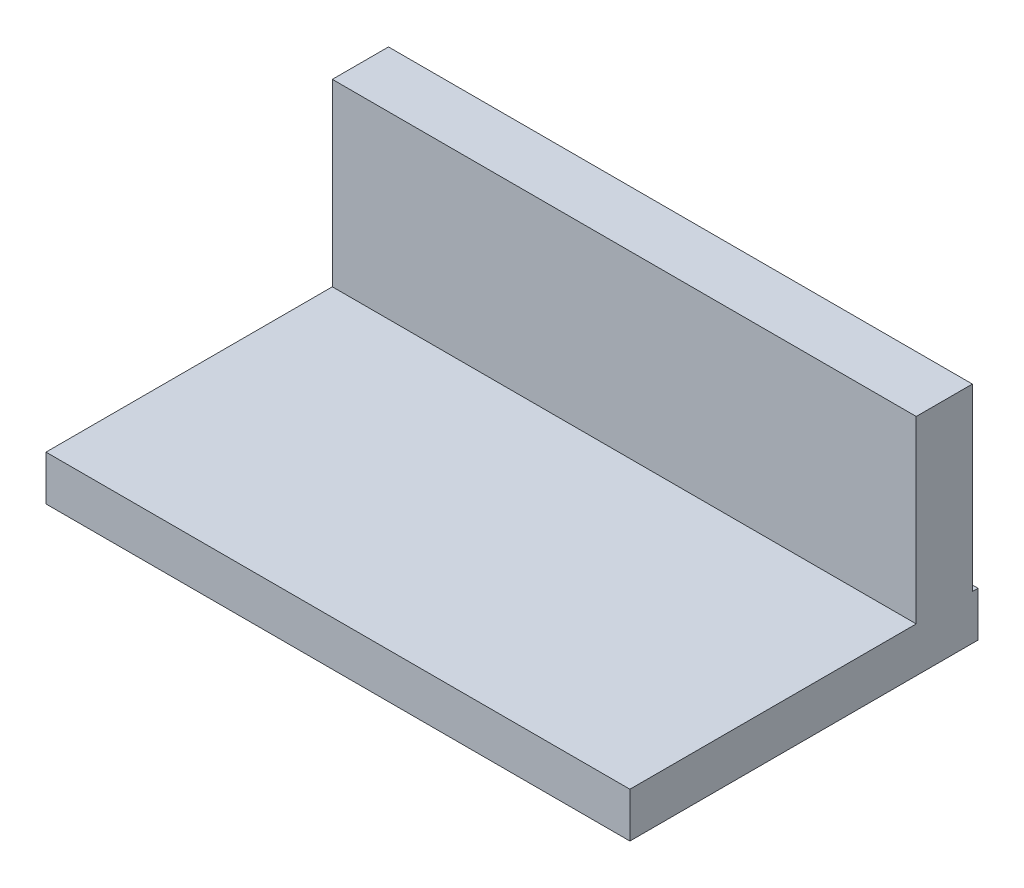
ISO-10303-21;
HEADER;
FILE_DESCRIPTION(('STEP AP214'),'2;1');
FILE_NAME('part.step','',(''),(''),'','','');
FILE_SCHEMA(('AUTOMOTIVE_DESIGN { 1 0 10303 214 1 1 1 1 }'));
ENDSEC;
DATA;
#1=APPLICATION_CONTEXT('core data for automotive mechanical design processes');
#2=APPLICATION_PROTOCOL_DEFINITION('international standard','automotive_design',2000,#1);
#3=PRODUCT_CONTEXT('',#1,'mechanical');
#4=PRODUCT('Part','Part','',(#3));
#5=PRODUCT_RELATED_PRODUCT_CATEGORY('part','',(#4));
#6=PRODUCT_DEFINITION_FORMATION('','',#4);
#7=PRODUCT_DEFINITION_CONTEXT('part definition',#1,'design');
#8=PRODUCT_DEFINITION('design','',#6,#7);
#9=PRODUCT_DEFINITION_SHAPE('','',#8);
#10=(LENGTH_UNIT() NAMED_UNIT(*) SI_UNIT(.MILLI.,.METRE.));
#11=(NAMED_UNIT(*) PLANE_ANGLE_UNIT() SI_UNIT($,.RADIAN.));
#12=(NAMED_UNIT(*) SI_UNIT($,.STERADIAN.) SOLID_ANGLE_UNIT());
#13=UNCERTAINTY_MEASURE_WITH_UNIT(LENGTH_MEASURE(1.E-05),#10,'distance_accuracy_value','');
#14=(GEOMETRIC_REPRESENTATION_CONTEXT(3) GLOBAL_UNCERTAINTY_ASSIGNED_CONTEXT((#13)) GLOBAL_UNIT_ASSIGNED_CONTEXT((#10,
#11,#12)) REPRESENTATION_CONTEXT('',''));
#15=CARTESIAN_POINT('',(0.,0.,0.));
#16=DIRECTION('',(0.,0.,1.));
#17=DIRECTION('',(1.,0.,0.));
#18=AXIS2_PLACEMENT_3D('',#15,#16,#17);
#19=CARTESIAN_POINT('',(0.,2.,0.));
#20=DIRECTION('',(0.,1.,0.));
#21=DIRECTION('',(0.,0.,1.));
#22=AXIS2_PLACEMENT_3D('',#19,#20,#21);
#23=PLANE('',#22);
#24=DIRECTION('',(-1.,0.,0.));
#25=VECTOR('',#24,1.);
#26=CARTESIAN_POINT('',(-13.,2.,-7.5));
#27=LINE('',#26,#25);
#28=CARTESIAN_POINT('',(13.,2.,-7.5));
#29=VERTEX_POINT('',#28);
#30=CARTESIAN_POINT('',(-13.,2.,-7.5));
#31=VERTEX_POINT('',#30);
#32=EDGE_CURVE('E117',#29,#31,#27,.T.);
#33=ORIENTED_EDGE('',*,*,#32,.F.);
#34=DIRECTION('',(0.,0.,-1.));
#35=VECTOR('',#34,1.);
#36=CARTESIAN_POINT('',(13.,2.,-7.75));
#37=LINE('',#36,#35);
#38=CARTESIAN_POINT('',(13.,2.,-7.75));
#39=VERTEX_POINT('',#38);
#40=EDGE_CURVE('E134',#29,#39,#37,.T.);
#41=ORIENTED_EDGE('',*,*,#40,.T.);
#42=DIRECTION('',(-1.,0.,0.));
#43=VECTOR('',#42,1.);
#44=CARTESIAN_POINT('',(-13.,2.,-7.75));
#45=LINE('',#44,#43);
#46=CARTESIAN_POINT('',(-13.,2.,-7.75));
#47=VERTEX_POINT('',#46);
#48=EDGE_CURVE('E133',#39,#47,#45,.T.);
#49=ORIENTED_EDGE('',*,*,#48,.T.);
#50=DIRECTION('',(0.,0.,1.));
#51=VECTOR('',#50,1.);
#52=CARTESIAN_POINT('',(-13.,2.,-7.75));
#53=LINE('',#52,#51);
#54=EDGE_CURVE('E56',#47,#31,#53,.T.);
#55=ORIENTED_EDGE('',*,*,#54,.T.);
#56=EDGE_LOOP('',(#33,#41,#49,#55));
#57=FACE_BOUND('',#56,.T.);
#58=ADVANCED_FACE('F33',(#57),#23,.T.);
#59=CARTESIAN_POINT('',(13.,2.,-7.75));
#60=DIRECTION('',(-1.,0.,0.));
#61=DIRECTION('',(0.,0.,1.));
#62=AXIS2_PLACEMENT_3D('',#59,#60,#61);
#63=PLANE('',#62);
#64=DIRECTION('',(0.,0.,-1.));
#65=VECTOR('',#64,1.);
#66=CARTESIAN_POINT('',(13.,0.,-7.75));
#67=LINE('',#66,#65);
#68=CARTESIAN_POINT('',(13.,0.,7.75));
#69=VERTEX_POINT('',#68);
#70=CARTESIAN_POINT('',(13.,0.,-7.75));
#71=VERTEX_POINT('',#70);
#72=EDGE_CURVE('E122',#69,#71,#67,.T.);
#73=ORIENTED_EDGE('',*,*,#72,.T.);
#74=DIRECTION('',(0.,-1.,0.));
#75=VECTOR('',#74,1.);
#76=CARTESIAN_POINT('',(13.,2.,-7.75));
#77=LINE('',#76,#75);
#78=EDGE_CURVE('E11',#39,#71,#77,.T.);
#79=ORIENTED_EDGE('',*,*,#78,.F.);
#80=ORIENTED_EDGE('',*,*,#40,.F.);
#81=DIRECTION('',(0.,-1.,0.));
#82=VECTOR('',#81,1.);
#83=CARTESIAN_POINT('',(13.,10.,-7.5));
#84=LINE('',#83,#82);
#85=CARTESIAN_POINT('',(13.,10.,-7.5));
#86=VERTEX_POINT('',#85);
#87=EDGE_CURVE('E127',#86,#29,#84,.T.);
#88=ORIENTED_EDGE('',*,*,#87,.F.);
#89=DIRECTION('',(0.,0.,-1.));
#90=VECTOR('',#89,1.);
#91=CARTESIAN_POINT('',(13.,10.,-7.5));
#92=LINE('',#91,#90);
#93=CARTESIAN_POINT('',(13.,10.,-5.));
#94=VERTEX_POINT('',#93);
#95=EDGE_CURVE('E107',#94,#86,#92,.T.);
#96=ORIENTED_EDGE('',*,*,#95,.F.);
#97=DIRECTION('',(0.,-1.,0.));
#98=VECTOR('',#97,1.);
#99=CARTESIAN_POINT('',(13.,10.,-5.));
#100=LINE('',#99,#98);
#101=CARTESIAN_POINT('',(13.,2.,-5.));
#102=VERTEX_POINT('',#101);
#103=EDGE_CURVE('E104',#94,#102,#100,.T.);
#104=ORIENTED_EDGE('',*,*,#103,.T.);
#105=CARTESIAN_POINT('',(13.,2.,7.75));
#106=VERTEX_POINT('',#105);
#107=EDGE_CURVE('E131',#106,#102,#37,.T.);
#108=ORIENTED_EDGE('',*,*,#107,.F.);
#109=DIRECTION('',(0.,-1.,0.));
#110=VECTOR('',#109,1.);
#111=CARTESIAN_POINT('',(13.,2.,7.75));
#112=LINE('',#111,#110);
#113=EDGE_CURVE('E138',#106,#69,#112,.T.);
#114=ORIENTED_EDGE('',*,*,#113,.T.);
#115=EDGE_LOOP('',(#73,#79,#80,#88,#96,#104,#108,#114));
#116=FACE_BOUND('',#115,.T.);
#117=ADVANCED_FACE('F35',(#116),#63,.F.);
#118=CARTESIAN_POINT('',(-13.,2.,-7.75));
#119=DIRECTION('',(0.,0.,1.));
#120=DIRECTION('',(1.,0.,0.));
#121=AXIS2_PLACEMENT_3D('',#118,#119,#120);
#122=PLANE('',#121);
#123=DIRECTION('',(-1.,0.,0.));
#124=VECTOR('',#123,1.);
#125=CARTESIAN_POINT('',(-13.,0.,-7.75));
#126=LINE('',#125,#124);
#127=CARTESIAN_POINT('',(-13.,0.,-7.75));
#128=VERTEX_POINT('',#127);
#129=EDGE_CURVE('E125',#71,#128,#126,.T.);
#130=ORIENTED_EDGE('',*,*,#129,.T.);
#131=DIRECTION('',(0.,-1.,0.));
#132=VECTOR('',#131,1.);
#133=CARTESIAN_POINT('',(-13.,2.,-7.75));
#134=LINE('',#133,#132);
#135=EDGE_CURVE('E41',#47,#128,#134,.T.);
#136=ORIENTED_EDGE('',*,*,#135,.F.);
#137=ORIENTED_EDGE('',*,*,#48,.F.);
#138=ORIENTED_EDGE('',*,*,#78,.T.);
#139=EDGE_LOOP('',(#130,#136,#137,#138));
#140=FACE_BOUND('',#139,.T.);
#141=ADVANCED_FACE('F177',(#140),#122,.F.);
#142=CARTESIAN_POINT('',(-13.,2.,-7.75));
#143=DIRECTION('',(1.,0.,0.));
#144=DIRECTION('',(0.,0.,-1.));
#145=AXIS2_PLACEMENT_3D('',#142,#143,#144);
#146=PLANE('',#145);
#147=DIRECTION('',(0.,0.,1.));
#148=VECTOR('',#147,1.);
#149=CARTESIAN_POINT('',(-13.,0.,-7.75));
#150=LINE('',#149,#148);
#151=CARTESIAN_POINT('',(-13.,0.,7.75));
#152=VERTEX_POINT('',#151);
#153=EDGE_CURVE('E141',#128,#152,#150,.T.);
#154=ORIENTED_EDGE('',*,*,#153,.T.);
#155=DIRECTION('',(0.,-1.,0.));
#156=VECTOR('',#155,1.);
#157=CARTESIAN_POINT('',(-13.,2.,7.75));
#158=LINE('',#157,#156);
#159=CARTESIAN_POINT('',(-13.,2.,7.75));
#160=VERTEX_POINT('',#159);
#161=EDGE_CURVE('E147',#160,#152,#158,.T.);
#162=ORIENTED_EDGE('',*,*,#161,.F.);
#163=CARTESIAN_POINT('',(-13.,2.,-5.));
#164=VERTEX_POINT('',#163);
#165=EDGE_CURVE('E121',#164,#160,#53,.T.);
#166=ORIENTED_EDGE('',*,*,#165,.F.);
#167=DIRECTION('',(0.,-1.,0.));
#168=VECTOR('',#167,1.);
#169=CARTESIAN_POINT('',(-13.,10.,-5.));
#170=LINE('',#169,#168);
#171=CARTESIAN_POINT('',(-13.,10.,-5.));
#172=VERTEX_POINT('',#171);
#173=EDGE_CURVE('E102',#172,#164,#170,.T.);
#174=ORIENTED_EDGE('',*,*,#173,.F.);
#175=DIRECTION('',(0.,0.,1.));
#176=VECTOR('',#175,1.);
#177=CARTESIAN_POINT('',(-13.,10.,-7.5));
#178=LINE('',#177,#176);
#179=CARTESIAN_POINT('',(-13.,10.,-7.5));
#180=VERTEX_POINT('',#179);
#181=EDGE_CURVE('E108',#180,#172,#178,.T.);
#182=ORIENTED_EDGE('',*,*,#181,.F.);
#183=DIRECTION('',(0.,-1.,0.));
#184=VECTOR('',#183,1.);
#185=CARTESIAN_POINT('',(-13.,10.,-7.5));
#186=LINE('',#185,#184);
#187=EDGE_CURVE('E171',#180,#31,#186,.T.);
#188=ORIENTED_EDGE('',*,*,#187,.T.);
#189=ORIENTED_EDGE('',*,*,#54,.F.);
#190=ORIENTED_EDGE('',*,*,#135,.T.);
#191=EDGE_LOOP('',(#154,#162,#166,#174,#182,#188,#189,#190));
#192=FACE_BOUND('',#191,.T.);
#193=ADVANCED_FACE('F119',(#192),#146,.F.);
#194=CARTESIAN_POINT('',(-13.,2.,7.75));
#195=DIRECTION('',(0.,0.,-1.));
#196=DIRECTION('',(-1.,0.,0.));
#197=AXIS2_PLACEMENT_3D('',#194,#195,#196);
#198=PLANE('',#197);
#199=DIRECTION('',(1.,0.,0.));
#200=VECTOR('',#199,1.);
#201=CARTESIAN_POINT('',(-13.,0.,7.75));
#202=LINE('',#201,#200);
#203=EDGE_CURVE('E143',#152,#69,#202,.T.);
#204=ORIENTED_EDGE('',*,*,#203,.T.);
#205=ORIENTED_EDGE('',*,*,#113,.F.);
#206=DIRECTION('',(1.,0.,0.));
#207=VECTOR('',#206,1.);
#208=CARTESIAN_POINT('',(-13.,2.,7.75));
#209=LINE('',#208,#207);
#210=EDGE_CURVE('E137',#160,#106,#209,.T.);
#211=ORIENTED_EDGE('',*,*,#210,.F.);
#212=ORIENTED_EDGE('',*,*,#161,.T.);
#213=EDGE_LOOP('',(#204,#205,#211,#212));
#214=FACE_BOUND('',#213,.T.);
#215=ADVANCED_FACE('F160',(#214),#198,.F.);
#216=DIRECTION('',(1.,0.,0.));
#217=VECTOR('',#216,1.);
#218=CARTESIAN_POINT('',(-13.,2.,-5.));
#219=LINE('',#218,#217);
#220=EDGE_CURVE('E48',#164,#102,#219,.T.);
#221=ORIENTED_EDGE('',*,*,#220,.F.);
#222=ORIENTED_EDGE('',*,*,#165,.T.);
#223=ORIENTED_EDGE('',*,*,#210,.T.);
#224=ORIENTED_EDGE('',*,*,#107,.T.);
#225=EDGE_LOOP('',(#221,#222,#223,#224));
#226=FACE_BOUND('',#225,.T.);
#227=ADVANCED_FACE('F165',(#226),#23,.T.);
#228=CARTESIAN_POINT('',(0.,0.,0.));
#229=DIRECTION('',(0.,1.,0.));
#230=DIRECTION('',(0.,0.,1.));
#231=AXIS2_PLACEMENT_3D('',#228,#229,#230);
#232=PLANE('',#231);
#233=ORIENTED_EDGE('',*,*,#72,.F.);
#234=ORIENTED_EDGE('',*,*,#203,.F.);
#235=ORIENTED_EDGE('',*,*,#153,.F.);
#236=ORIENTED_EDGE('',*,*,#129,.F.);
#237=EDGE_LOOP('',(#233,#234,#235,#236));
#238=FACE_BOUND('',#237,.T.);
#239=ADVANCED_FACE('F157',(#238),#232,.F.);
#240=CARTESIAN_POINT('',(-13.,10.,-5.));
#241=DIRECTION('',(0.,0.,-1.));
#242=DIRECTION('',(-1.,0.,0.));
#243=AXIS2_PLACEMENT_3D('',#240,#241,#242);
#244=PLANE('',#243);
#245=ORIENTED_EDGE('',*,*,#220,.T.);
#246=ORIENTED_EDGE('',*,*,#103,.F.);
#247=DIRECTION('',(1.,0.,0.));
#248=VECTOR('',#247,1.);
#249=CARTESIAN_POINT('',(-13.,10.,-5.));
#250=LINE('',#249,#248);
#251=EDGE_CURVE('E98',#172,#94,#250,.T.);
#252=ORIENTED_EDGE('',*,*,#251,.F.);
#253=ORIENTED_EDGE('',*,*,#173,.T.);
#254=EDGE_LOOP('',(#245,#246,#252,#253));
#255=FACE_BOUND('',#254,.T.);
#256=ADVANCED_FACE('F100',(#255),#244,.F.);
#257=CARTESIAN_POINT('',(-13.,10.,-7.5));
#258=DIRECTION('',(0.,0.,1.));
#259=DIRECTION('',(1.,0.,0.));
#260=AXIS2_PLACEMENT_3D('',#257,#258,#259);
#261=PLANE('',#260);
#262=ORIENTED_EDGE('',*,*,#32,.T.);
#263=ORIENTED_EDGE('',*,*,#187,.F.);
#264=DIRECTION('',(-1.,0.,0.));
#265=VECTOR('',#264,1.);
#266=CARTESIAN_POINT('',(-13.,10.,-7.5));
#267=LINE('',#266,#265);
#268=EDGE_CURVE('E113',#86,#180,#267,.T.);
#269=ORIENTED_EDGE('',*,*,#268,.F.);
#270=ORIENTED_EDGE('',*,*,#87,.T.);
#271=EDGE_LOOP('',(#262,#263,#269,#270));
#272=FACE_BOUND('',#271,.T.);
#273=ADVANCED_FACE('F175',(#272),#261,.F.);
#274=CARTESIAN_POINT('',(0.,10.,0.));
#275=DIRECTION('',(0.,1.,0.));
#276=DIRECTION('',(0.,0.,1.));
#277=AXIS2_PLACEMENT_3D('',#274,#275,#276);
#278=PLANE('',#277);
#279=ORIENTED_EDGE('',*,*,#181,.T.);
#280=ORIENTED_EDGE('',*,*,#251,.T.);
#281=ORIENTED_EDGE('',*,*,#95,.T.);
#282=ORIENTED_EDGE('',*,*,#268,.T.);
#283=EDGE_LOOP('',(#279,#280,#281,#282));
#284=FACE_BOUND('',#283,.T.);
#285=ADVANCED_FACE('F111',(#284),#278,.T.);
#286=CLOSED_SHELL('',(#58,#117,#141,#193,#215,#227,#239,#256,#273,#285));
#287=MANIFOLD_SOLID_BREP('B2',#286);
#288=ADVANCED_BREP_SHAPE_REPRESENTATION('',(#18,#287),#14);
#289=SHAPE_DEFINITION_REPRESENTATION(#9,#288);
ENDSEC;
END-ISO-10303-21;
